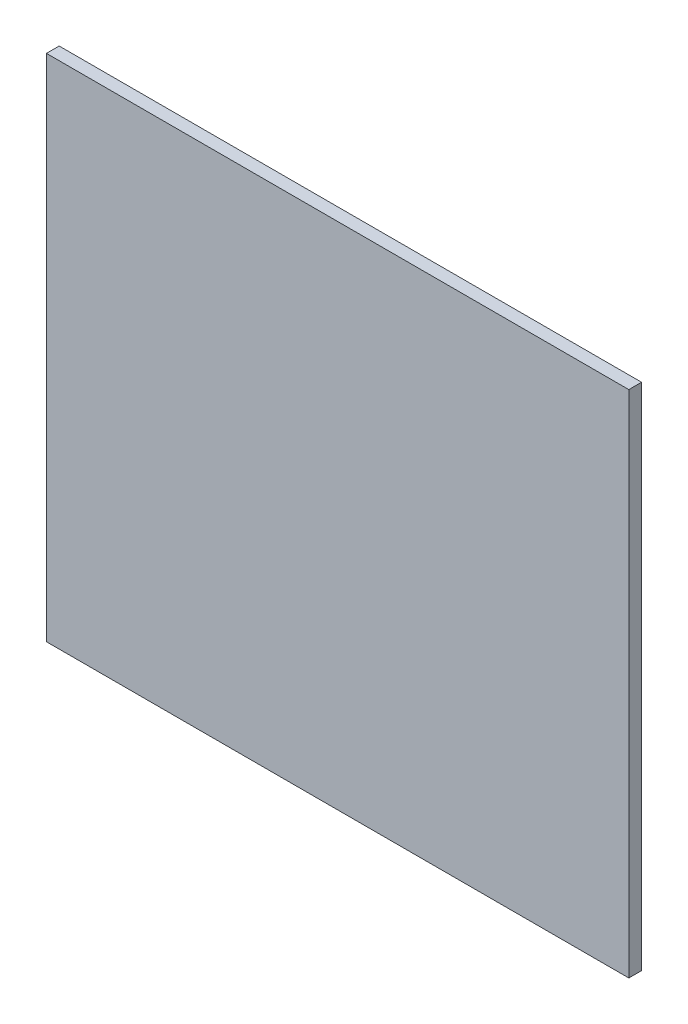
ISO-10303-21;
HEADER;
FILE_DESCRIPTION(('STEP AP214'),'2;1');
FILE_NAME('part.step','',(''),(''),'','','');
FILE_SCHEMA(('AUTOMOTIVE_DESIGN { 1 0 10303 214 1 1 1 1 }'));
ENDSEC;
DATA;
#1=APPLICATION_CONTEXT('core data for automotive mechanical design processes');
#2=APPLICATION_PROTOCOL_DEFINITION('international standard','automotive_design',2000,#1);
#3=PRODUCT_CONTEXT('',#1,'mechanical');
#4=PRODUCT('Part','Part','',(#3));
#5=PRODUCT_RELATED_PRODUCT_CATEGORY('part','',(#4));
#6=PRODUCT_DEFINITION_FORMATION('','',#4);
#7=PRODUCT_DEFINITION_CONTEXT('part definition',#1,'design');
#8=PRODUCT_DEFINITION('design','',#6,#7);
#9=PRODUCT_DEFINITION_SHAPE('','',#8);
#10=(LENGTH_UNIT() NAMED_UNIT(*) SI_UNIT(.MILLI.,.METRE.));
#11=(NAMED_UNIT(*) PLANE_ANGLE_UNIT() SI_UNIT($,.RADIAN.));
#12=(NAMED_UNIT(*) SI_UNIT($,.STERADIAN.) SOLID_ANGLE_UNIT());
#13=UNCERTAINTY_MEASURE_WITH_UNIT(LENGTH_MEASURE(1.E-05),#10,'distance_accuracy_value','');
#14=(GEOMETRIC_REPRESENTATION_CONTEXT(3) GLOBAL_UNCERTAINTY_ASSIGNED_CONTEXT((#13)) GLOBAL_UNIT_ASSIGNED_CONTEXT((#10,
#11,#12)) REPRESENTATION_CONTEXT('',''));
#15=CARTESIAN_POINT('',(0.,0.,0.));
#16=DIRECTION('',(0.,0.,1.));
#17=DIRECTION('',(1.,0.,0.));
#18=AXIS2_PLACEMENT_3D('',#15,#16,#17);
#19=CARTESIAN_POINT('',(109.,-52.25,1.635));
#20=DIRECTION('',(0.,0.,-1.));
#21=DIRECTION('',(0.,-1.,0.));
#22=AXIS2_PLACEMENT_3D('',#19,#20,#21);
#23=PLANE('',#22);
#24=DIRECTION('',(0.,-1.,0.));
#25=VECTOR('',#24,1.);
#26=CARTESIAN_POINT('',(109.8,-51.55,1.635));
#27=LINE('',#26,#25);
#28=CARTESIAN_POINT('',(109.8,-51.55,1.635));
#29=VERTEX_POINT('',#28);
#30=CARTESIAN_POINT('',(109.8,-52.95,1.635));
#31=VERTEX_POINT('',#30);
#32=EDGE_CURVE('E26',#29,#31,#27,.T.);
#33=ORIENTED_EDGE('',*,*,#32,.F.);
#34=DIRECTION('',(1.,0.,0.));
#35=VECTOR('',#34,1.);
#36=CARTESIAN_POINT('',(108.2,-51.55,1.635));
#37=LINE('',#36,#35);
#38=CARTESIAN_POINT('',(108.2,-51.55,1.635));
#39=VERTEX_POINT('',#38);
#40=EDGE_CURVE('E104',#39,#29,#37,.T.);
#41=ORIENTED_EDGE('',*,*,#40,.F.);
#42=DIRECTION('',(0.,1.,0.));
#43=VECTOR('',#42,1.);
#44=CARTESIAN_POINT('',(108.2,-52.95,1.635));
#45=LINE('',#44,#43);
#46=CARTESIAN_POINT('',(108.2,-52.95,1.635));
#47=VERTEX_POINT('',#46);
#48=EDGE_CURVE('E84',#47,#39,#45,.T.);
#49=ORIENTED_EDGE('',*,*,#48,.F.);
#50=DIRECTION('',(-1.,0.,0.));
#51=VECTOR('',#50,1.);
#52=CARTESIAN_POINT('',(109.8,-52.95,1.635));
#53=LINE('',#52,#51);
#54=EDGE_CURVE('E88',#31,#47,#53,.T.);
#55=ORIENTED_EDGE('',*,*,#54,.F.);
#56=EDGE_LOOP('',(#33,#41,#49,#55));
#57=FACE_BOUND('',#56,.T.);
#58=ADVANCED_FACE('F17',(#57),#23,.F.);
#59=CARTESIAN_POINT('',(109.,-52.25,1.6));
#60=DIRECTION('',(0.,0.,-1.));
#61=DIRECTION('',(0.,-1.,0.));
#62=AXIS2_PLACEMENT_3D('',#59,#60,#61);
#63=PLANE('',#62);
#64=DIRECTION('',(-1.,0.,0.));
#65=VECTOR('',#64,1.);
#66=CARTESIAN_POINT('',(109.8,-52.95,1.6));
#67=LINE('',#66,#65);
#68=CARTESIAN_POINT('',(109.8,-52.95,1.6));
#69=VERTEX_POINT('',#68);
#70=CARTESIAN_POINT('',(108.2,-52.95,1.6));
#71=VERTEX_POINT('',#70);
#72=EDGE_CURVE('E73',#69,#71,#67,.T.);
#73=ORIENTED_EDGE('',*,*,#72,.T.);
#74=DIRECTION('',(0.,1.,0.));
#75=VECTOR('',#74,1.);
#76=CARTESIAN_POINT('',(108.2,-52.95,1.6));
#77=LINE('',#76,#75);
#78=CARTESIAN_POINT('',(108.2,-51.55,1.6));
#79=VERTEX_POINT('',#78);
#80=EDGE_CURVE('E108',#71,#79,#77,.T.);
#81=ORIENTED_EDGE('',*,*,#80,.T.);
#82=DIRECTION('',(1.,0.,0.));
#83=VECTOR('',#82,1.);
#84=CARTESIAN_POINT('',(108.2,-51.55,1.6));
#85=LINE('',#84,#83);
#86=CARTESIAN_POINT('',(109.8,-51.55,1.6));
#87=VERTEX_POINT('',#86);
#88=EDGE_CURVE('E20',#79,#87,#85,.T.);
#89=ORIENTED_EDGE('',*,*,#88,.T.);
#90=DIRECTION('',(0.,-1.,0.));
#91=VECTOR('',#90,1.);
#92=CARTESIAN_POINT('',(109.8,-51.55,1.6));
#93=LINE('',#92,#91);
#94=EDGE_CURVE('E11',#87,#69,#93,.T.);
#95=ORIENTED_EDGE('',*,*,#94,.T.);
#96=EDGE_LOOP('',(#73,#81,#89,#95));
#97=FACE_BOUND('',#96,.T.);
#98=ADVANCED_FACE('F71',(#97),#63,.T.);
#99=CARTESIAN_POINT('',(109.8,-51.55,1.6));
#100=DIRECTION('',(1.,0.,0.));
#101=DIRECTION('',(0.,1.,0.));
#102=AXIS2_PLACEMENT_3D('',#99,#100,#101);
#103=PLANE('',#102);
#104=DIRECTION('',(0.,0.,1.));
#105=VECTOR('',#104,1.);
#106=CARTESIAN_POINT('',(109.8,-51.55,1.6));
#107=LINE('',#106,#105);
#108=EDGE_CURVE('E101',#87,#29,#107,.T.);
#109=ORIENTED_EDGE('',*,*,#108,.T.);
#110=ORIENTED_EDGE('',*,*,#32,.T.);
#111=DIRECTION('',(0.,0.,1.));
#112=VECTOR('',#111,1.);
#113=CARTESIAN_POINT('',(109.8,-52.95,1.6));
#114=LINE('',#113,#112);
#115=EDGE_CURVE('E80',#69,#31,#114,.T.);
#116=ORIENTED_EDGE('',*,*,#115,.F.);
#117=ORIENTED_EDGE('',*,*,#94,.F.);
#118=EDGE_LOOP('',(#109,#110,#116,#117));
#119=FACE_BOUND('',#118,.T.);
#120=ADVANCED_FACE('F86',(#119),#103,.T.);
#121=CARTESIAN_POINT('',(108.2,-51.55,1.6));
#122=DIRECTION('',(0.,1.,0.));
#123=DIRECTION('',(1.,0.,0.));
#124=AXIS2_PLACEMENT_3D('',#121,#122,#123);
#125=PLANE('',#124);
#126=DIRECTION('',(0.,0.,1.));
#127=VECTOR('',#126,1.);
#128=CARTESIAN_POINT('',(108.2,-51.55,1.6));
#129=LINE('',#128,#127);
#130=EDGE_CURVE('E99',#79,#39,#129,.T.);
#131=ORIENTED_EDGE('',*,*,#130,.T.);
#132=ORIENTED_EDGE('',*,*,#40,.T.);
#133=ORIENTED_EDGE('',*,*,#108,.F.);
#134=ORIENTED_EDGE('',*,*,#88,.F.);
#135=EDGE_LOOP('',(#131,#132,#133,#134));
#136=FACE_BOUND('',#135,.T.);
#137=ADVANCED_FACE('F117',(#136),#125,.T.);
#138=CARTESIAN_POINT('',(108.2,-52.95,1.6));
#139=DIRECTION('',(-1.,0.,0.));
#140=DIRECTION('',(0.,0.,1.));
#141=AXIS2_PLACEMENT_3D('',#138,#139,#140);
#142=PLANE('',#141);
#143=DIRECTION('',(0.,0.,1.));
#144=VECTOR('',#143,1.);
#145=CARTESIAN_POINT('',(108.2,-52.95,1.6));
#146=LINE('',#145,#144);
#147=EDGE_CURVE('E82',#71,#47,#146,.T.);
#148=ORIENTED_EDGE('',*,*,#147,.T.);
#149=ORIENTED_EDGE('',*,*,#48,.T.);
#150=ORIENTED_EDGE('',*,*,#130,.F.);
#151=ORIENTED_EDGE('',*,*,#80,.F.);
#152=EDGE_LOOP('',(#148,#149,#150,#151));
#153=FACE_BOUND('',#152,.T.);
#154=ADVANCED_FACE('F120',(#153),#142,.T.);
#155=CARTESIAN_POINT('',(109.8,-52.95,1.6));
#156=DIRECTION('',(0.,-1.,0.));
#157=DIRECTION('',(0.,0.,-1.));
#158=AXIS2_PLACEMENT_3D('',#155,#156,#157);
#159=PLANE('',#158);
#160=ORIENTED_EDGE('',*,*,#115,.T.);
#161=ORIENTED_EDGE('',*,*,#54,.T.);
#162=ORIENTED_EDGE('',*,*,#147,.F.);
#163=ORIENTED_EDGE('',*,*,#72,.F.);
#164=EDGE_LOOP('',(#160,#161,#162,#163));
#165=FACE_BOUND('',#164,.T.);
#166=ADVANCED_FACE('F78',(#165),#159,.T.);
#167=CLOSED_SHELL('',(#58,#98,#120,#137,#154,#166));
#168=MANIFOLD_SOLID_BREP('B1',#167);
#169=ADVANCED_BREP_SHAPE_REPRESENTATION('',(#18,#168),#14);
#170=SHAPE_DEFINITION_REPRESENTATION(#9,#169);
ENDSEC;
END-ISO-10303-21;
